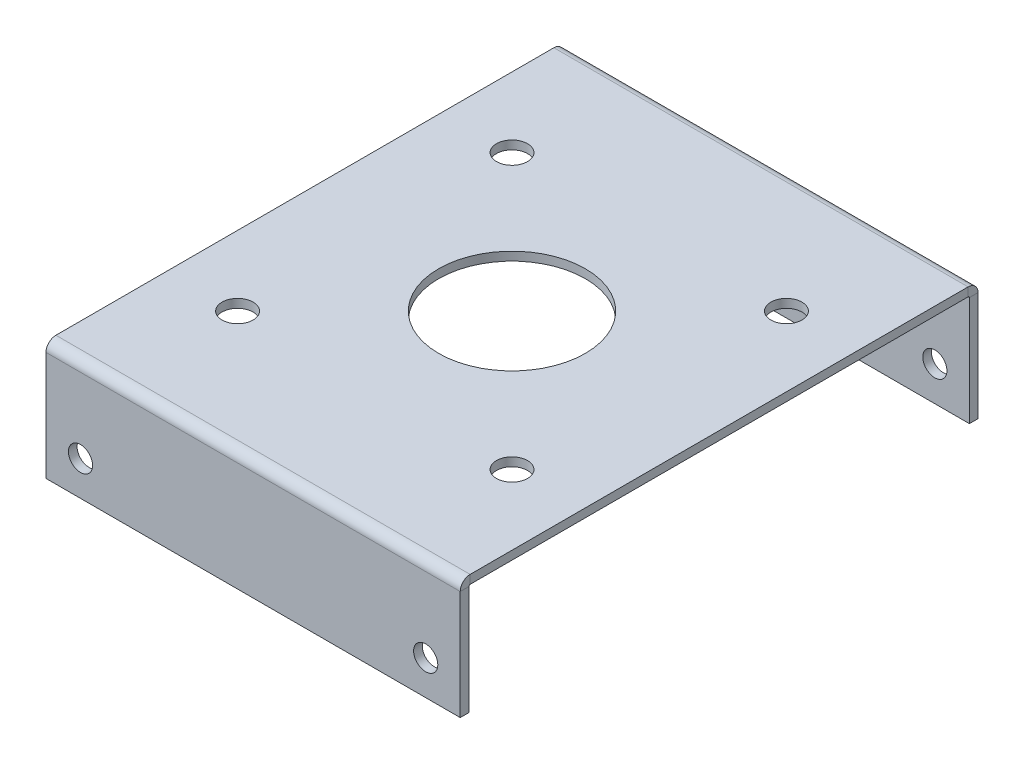
ISO-10303-21;
HEADER;
FILE_DESCRIPTION(('STEP AP214'),'2;1');
FILE_NAME('part.step','',(''),(''),'','','');
FILE_SCHEMA(('AUTOMOTIVE_DESIGN { 1 0 10303 214 1 1 1 1 }'));
ENDSEC;
DATA;
#1=APPLICATION_CONTEXT('core data for automotive mechanical design processes');
#2=APPLICATION_PROTOCOL_DEFINITION('international standard','automotive_design',2000,#1);
#3=PRODUCT_CONTEXT('',#1,'mechanical');
#4=PRODUCT('Part','Part','',(#3));
#5=PRODUCT_RELATED_PRODUCT_CATEGORY('part','',(#4));
#6=PRODUCT_DEFINITION_FORMATION('','',#4);
#7=PRODUCT_DEFINITION_CONTEXT('part definition',#1,'design');
#8=PRODUCT_DEFINITION('design','',#6,#7);
#9=PRODUCT_DEFINITION_SHAPE('','',#8);
#10=(LENGTH_UNIT() NAMED_UNIT(*) SI_UNIT(.MILLI.,.METRE.));
#11=(NAMED_UNIT(*) PLANE_ANGLE_UNIT() SI_UNIT($,.RADIAN.));
#12=(NAMED_UNIT(*) SI_UNIT($,.STERADIAN.) SOLID_ANGLE_UNIT());
#13=UNCERTAINTY_MEASURE_WITH_UNIT(LENGTH_MEASURE(1.E-05),#10,'distance_accuracy_value','');
#14=(GEOMETRIC_REPRESENTATION_CONTEXT(3) GLOBAL_UNCERTAINTY_ASSIGNED_CONTEXT((#13)) GLOBAL_UNIT_ASSIGNED_CONTEXT((#10,
#11,#12)) REPRESENTATION_CONTEXT('',''));
#15=CARTESIAN_POINT('',(0.,0.,0.));
#16=DIRECTION('',(0.,0.,1.));
#17=DIRECTION('',(1.,0.,0.));
#18=AXIS2_PLACEMENT_3D('',#15,#16,#17);
#19=CARTESIAN_POINT('',(0.,-5.,0.));
#20=DIRECTION('',(0.,-1.,0.));
#21=DIRECTION('',(0.,0.,-1.));
#22=AXIS2_PLACEMENT_3D('',#19,#20,#21);
#23=PLANE('',#22);
#24=CARTESIAN_POINT('',(79.5,-5.,79.5));
#25=DIRECTION('',(0.,-1.,0.));
#26=DIRECTION('',(0.,0.,-1.));
#27=AXIS2_PLACEMENT_3D('',#24,#25,#26);
#28=CIRCLE('',#27,8.99999999999999);
#29=CARTESIAN_POINT('',(79.5,-5.,70.5));
#30=VERTEX_POINT('',#29);
#31=EDGE_CURVE('E304',#30,#30,#28,.T.);
#32=ORIENTED_EDGE('',*,*,#31,.F.);
#33=EDGE_LOOP('',(#32));
#34=FACE_BOUND('',#33,.T.);
#35=CARTESIAN_POINT('',(-79.5,-5.,79.5));
#36=DIRECTION('',(0.,-1.,0.));
#37=DIRECTION('',(0.,0.,-1.));
#38=AXIS2_PLACEMENT_3D('',#35,#36,#37);
#39=CIRCLE('',#38,8.99999999999999);
#40=CARTESIAN_POINT('',(-79.5,-5.,70.5));
#41=VERTEX_POINT('',#40);
#42=EDGE_CURVE('E735',#41,#41,#39,.T.);
#43=ORIENTED_EDGE('',*,*,#42,.F.);
#44=EDGE_LOOP('',(#43));
#45=FACE_BOUND('',#44,.T.);
#46=CARTESIAN_POINT('',(-79.5,-5.,-79.5));
#47=DIRECTION('',(0.,-1.,0.));
#48=DIRECTION('',(0.,0.,-1.));
#49=AXIS2_PLACEMENT_3D('',#46,#47,#48);
#50=CIRCLE('',#49,8.99999999999999);
#51=CARTESIAN_POINT('',(-79.5,-5.,-88.5));
#52=VERTEX_POINT('',#51);
#53=EDGE_CURVE('E733',#52,#52,#50,.T.);
#54=ORIENTED_EDGE('',*,*,#53,.F.);
#55=EDGE_LOOP('',(#54));
#56=FACE_BOUND('',#55,.T.);
#57=CARTESIAN_POINT('',(79.5,-5.,-79.5));
#58=DIRECTION('',(0.,-1.,0.));
#59=DIRECTION('',(0.,0.,-1.));
#60=AXIS2_PLACEMENT_3D('',#57,#58,#59);
#61=CIRCLE('',#60,8.99999999999999);
#62=CARTESIAN_POINT('',(79.5,-5.,-88.5));
#63=VERTEX_POINT('',#62);
#64=EDGE_CURVE('E730',#63,#63,#61,.T.);
#65=ORIENTED_EDGE('',*,*,#64,.F.);
#66=EDGE_LOOP('',(#65));
#67=FACE_BOUND('',#66,.T.);
#68=CARTESIAN_POINT('',(0.,-5.,0.));
#69=DIRECTION('',(0.,-1.,0.));
#70=DIRECTION('',(0.,0.,-1.));
#71=AXIS2_PLACEMENT_3D('',#68,#69,#70);
#72=CIRCLE('',#71,42.5);
#73=CARTESIAN_POINT('',(0.,-5.,-42.5));
#74=VERTEX_POINT('',#73);
#75=EDGE_CURVE('E726',#74,#74,#72,.T.);
#76=ORIENTED_EDGE('',*,*,#75,.F.);
#77=EDGE_LOOP('',(#76));
#78=FACE_BOUND('',#77,.T.);
#79=DIRECTION('',(0.,0.,-1.));
#80=VECTOR('',#79,1.);
#81=CARTESIAN_POINT('',(120.,-5.,150.));
#82=LINE('',#81,#80);
#83=CARTESIAN_POINT('',(120.,-5.,144.2634));
#84=VERTEX_POINT('',#83);
#85=CARTESIAN_POINT('',(120.,-5.,-144.2634));
#86=VERTEX_POINT('',#85);
#87=EDGE_CURVE('E86',#84,#86,#82,.T.);
#88=ORIENTED_EDGE('',*,*,#87,.F.);
#89=DIRECTION('',(-1.,0.,0.));
#90=VECTOR('',#89,1.);
#91=CARTESIAN_POINT('',(-120.,-5.,144.2634));
#92=LINE('',#91,#90);
#93=CARTESIAN_POINT('',(-120.,-5.,144.2634));
#94=VERTEX_POINT('',#93);
#95=EDGE_CURVE('E223',#94,#84,#92,.F.);
#96=ORIENTED_EDGE('',*,*,#95,.F.);
#97=DIRECTION('',(0.,0.,1.));
#98=VECTOR('',#97,1.);
#99=CARTESIAN_POINT('',(-120.,-5.,150.));
#100=LINE('',#99,#98);
#101=CARTESIAN_POINT('',(-120.,-5.,-144.2634));
#102=VERTEX_POINT('',#101);
#103=EDGE_CURVE('E13',#102,#94,#100,.T.);
#104=ORIENTED_EDGE('',*,*,#103,.F.);
#105=DIRECTION('',(1.,0.,0.));
#106=VECTOR('',#105,1.);
#107=CARTESIAN_POINT('',(120.,-5.00000000000001,-144.2634));
#108=LINE('',#107,#106);
#109=EDGE_CURVE('E277',#86,#102,#108,.F.);
#110=ORIENTED_EDGE('',*,*,#109,.F.);
#111=EDGE_LOOP('',(#88,#96,#104,#110));
#112=FACE_BOUND('',#111,.T.);
#113=ADVANCED_FACE('F77',(#34,#45,#56,#67,#78,#112),#23,.T.);
#114=CARTESIAN_POINT('',(0.,0.,0.));
#115=DIRECTION('',(0.,-1.,0.));
#116=DIRECTION('',(0.,0.,-1.));
#117=AXIS2_PLACEMENT_3D('',#114,#115,#116);
#118=PLANE('',#117);
#119=CARTESIAN_POINT('',(79.5,0.,79.5));
#120=DIRECTION('',(0.,1.,0.));
#121=DIRECTION('',(0.,0.,1.));
#122=AXIS2_PLACEMENT_3D('',#119,#120,#121);
#123=CIRCLE('',#122,8.99999999999999);
#124=CARTESIAN_POINT('',(79.5,0.,88.5));
#125=VERTEX_POINT('',#124);
#126=EDGE_CURVE('E715',#125,#125,#123,.T.);
#127=ORIENTED_EDGE('',*,*,#126,.F.);
#128=EDGE_LOOP('',(#127));
#129=FACE_BOUND('',#128,.T.);
#130=CARTESIAN_POINT('',(-79.5,0.,79.5));
#131=DIRECTION('',(0.,1.,0.));
#132=DIRECTION('',(0.,0.,1.));
#133=AXIS2_PLACEMENT_3D('',#130,#131,#132);
#134=CIRCLE('',#133,8.99999999999999);
#135=CARTESIAN_POINT('',(-79.5,0.,88.5));
#136=VERTEX_POINT('',#135);
#137=EDGE_CURVE('E716',#136,#136,#134,.T.);
#138=ORIENTED_EDGE('',*,*,#137,.F.);
#139=EDGE_LOOP('',(#138));
#140=FACE_BOUND('',#139,.T.);
#141=CARTESIAN_POINT('',(-79.5,0.,-79.5));
#142=DIRECTION('',(0.,1.,0.));
#143=DIRECTION('',(0.,0.,1.));
#144=AXIS2_PLACEMENT_3D('',#141,#142,#143);
#145=CIRCLE('',#144,8.99999999999999);
#146=CARTESIAN_POINT('',(-79.5,0.,-70.5));
#147=VERTEX_POINT('',#146);
#148=EDGE_CURVE('E719',#147,#147,#145,.T.);
#149=ORIENTED_EDGE('',*,*,#148,.F.);
#150=EDGE_LOOP('',(#149));
#151=FACE_BOUND('',#150,.T.);
#152=CARTESIAN_POINT('',(79.5,0.,-79.5));
#153=DIRECTION('',(0.,1.,0.));
#154=DIRECTION('',(0.,0.,1.));
#155=AXIS2_PLACEMENT_3D('',#152,#153,#154);
#156=CIRCLE('',#155,8.99999999999999);
#157=CARTESIAN_POINT('',(79.5,0.,-70.5));
#158=VERTEX_POINT('',#157);
#159=EDGE_CURVE('E727',#158,#158,#156,.T.);
#160=ORIENTED_EDGE('',*,*,#159,.F.);
#161=EDGE_LOOP('',(#160));
#162=FACE_BOUND('',#161,.T.);
#163=CARTESIAN_POINT('',(0.,0.,0.));
#164=DIRECTION('',(0.,1.,0.));
#165=DIRECTION('',(0.,0.,1.));
#166=AXIS2_PLACEMENT_3D('',#163,#164,#165);
#167=CIRCLE('',#166,42.5);
#168=CARTESIAN_POINT('',(0.,0.,42.5));
#169=VERTEX_POINT('',#168);
#170=EDGE_CURVE('E723',#169,#169,#167,.T.);
#171=ORIENTED_EDGE('',*,*,#170,.F.);
#172=EDGE_LOOP('',(#171));
#173=FACE_BOUND('',#172,.T.);
#174=DIRECTION('',(-1.,0.,0.));
#175=VECTOR('',#174,1.);
#176=CARTESIAN_POINT('',(-120.,0.,144.2634));
#177=LINE('',#176,#175);
#178=CARTESIAN_POINT('',(-120.,0.,144.2634));
#179=VERTEX_POINT('',#178);
#180=CARTESIAN_POINT('',(120.,0.,144.2634));
#181=VERTEX_POINT('',#180);
#182=EDGE_CURVE('E211',#179,#181,#177,.F.);
#183=ORIENTED_EDGE('',*,*,#182,.T.);
#184=DIRECTION('',(0.,0.,-1.));
#185=VECTOR('',#184,1.);
#186=CARTESIAN_POINT('',(120.,0.,150.));
#187=LINE('',#186,#185);
#188=CARTESIAN_POINT('',(120.,0.,-144.2634));
#189=VERTEX_POINT('',#188);
#190=EDGE_CURVE('E283',#181,#189,#187,.T.);
#191=ORIENTED_EDGE('',*,*,#190,.T.);
#192=DIRECTION('',(1.,0.,0.));
#193=VECTOR('',#192,1.);
#194=CARTESIAN_POINT('',(120.,0.,-144.2634));
#195=LINE('',#194,#193);
#196=CARTESIAN_POINT('',(-120.,0.,-144.2634));
#197=VERTEX_POINT('',#196);
#198=EDGE_CURVE('E265',#189,#197,#195,.F.);
#199=ORIENTED_EDGE('',*,*,#198,.T.);
#200=DIRECTION('',(0.,0.,1.));
#201=VECTOR('',#200,1.);
#202=CARTESIAN_POINT('',(-120.,0.,150.));
#203=LINE('',#202,#201);
#204=EDGE_CURVE('E285',#197,#179,#203,.T.);
#205=ORIENTED_EDGE('',*,*,#204,.T.);
#206=EDGE_LOOP('',(#183,#191,#199,#205));
#207=FACE_BOUND('',#206,.T.);
#208=ADVANCED_FACE('F336',(#129,#140,#151,#162,#173,#207),#118,.F.);
#209=CARTESIAN_POINT('',(-120.,-5.,150.));
#210=DIRECTION('',(-1.,0.,0.));
#211=DIRECTION('',(0.,0.,1.));
#212=AXIS2_PLACEMENT_3D('',#209,#210,#211);
#213=PLANE('',#212);
#214=ORIENTED_EDGE('',*,*,#103,.T.);
#215=DIRECTION('',(0.,1.,0.));
#216=VECTOR('',#215,1.);
#217=CARTESIAN_POINT('',(-120.,-5.,144.2634));
#218=LINE('',#217,#216);
#219=EDGE_CURVE('E217',#94,#179,#218,.T.);
#220=ORIENTED_EDGE('',*,*,#219,.T.);
#221=ORIENTED_EDGE('',*,*,#204,.F.);
#222=DIRECTION('',(0.,1.,0.));
#223=VECTOR('',#222,1.);
#224=CARTESIAN_POINT('',(-120.,-5.00000000000001,-144.2634));
#225=LINE('',#224,#223);
#226=EDGE_CURVE('E93',#102,#197,#225,.T.);
#227=ORIENTED_EDGE('',*,*,#226,.F.);
#228=EDGE_LOOP('',(#214,#220,#221,#227));
#229=FACE_BOUND('',#228,.T.);
#230=ADVANCED_FACE('F330',(#229),#213,.T.);
#231=CARTESIAN_POINT('',(120.,-5.,150.));
#232=DIRECTION('',(1.,0.,0.));
#233=DIRECTION('',(0.,0.,-1.));
#234=AXIS2_PLACEMENT_3D('',#231,#232,#233);
#235=PLANE('',#234);
#236=DIRECTION('',(0.,1.,0.));
#237=VECTOR('',#236,1.);
#238=CARTESIAN_POINT('',(120.,-5.,144.2634));
#239=LINE('',#238,#237);
#240=EDGE_CURVE('E229',#84,#181,#239,.T.);
#241=ORIENTED_EDGE('',*,*,#240,.F.);
#242=ORIENTED_EDGE('',*,*,#87,.T.);
#243=DIRECTION('',(0.,1.,0.));
#244=VECTOR('',#243,1.);
#245=CARTESIAN_POINT('',(120.,-5.00000000000001,-144.2634));
#246=LINE('',#245,#244);
#247=EDGE_CURVE('E271',#86,#189,#246,.T.);
#248=ORIENTED_EDGE('',*,*,#247,.T.);
#249=ORIENTED_EDGE('',*,*,#190,.F.);
#250=EDGE_LOOP('',(#241,#242,#248,#249));
#251=FACE_BOUND('',#250,.T.);
#252=ADVANCED_FACE('F79',(#251),#235,.T.);
#253=CARTESIAN_POINT('',(-120.,-5.73660000000001,-144.2634));
#254=DIRECTION('',(-1.,0.,0.));
#255=DIRECTION('',(0.,0.,1.));
#256=AXIS2_PLACEMENT_3D('',#253,#254,#255);
#257=PLANE('',#256);
#258=DIRECTION('',(0.,0.,1.));
#259=VECTOR('',#258,1.);
#260=CARTESIAN_POINT('',(-120.,-5.73659999999997,-150.));
#261=LINE('',#260,#259);
#262=CARTESIAN_POINT('',(-120.,-5.73660000000001,-145.));
#263=VERTEX_POINT('',#262);
#264=CARTESIAN_POINT('',(-120.,-5.73659999999999,-150.));
#265=VERTEX_POINT('',#264);
#266=EDGE_CURVE('E232',#263,#265,#261,.F.);
#267=ORIENTED_EDGE('',*,*,#266,.F.);
#268=CARTESIAN_POINT('',(-120.,-5.73660000000001,-144.2634));
#269=DIRECTION('',(1.,0.,0.));
#270=DIRECTION('',(0.,0.,-1.));
#271=AXIS2_PLACEMENT_3D('',#268,#269,#270);
#272=CIRCLE('',#271,0.736600000000004);
#273=EDGE_CURVE('E274',#102,#263,#272,.F.);
#274=ORIENTED_EDGE('',*,*,#273,.F.);
#275=ORIENTED_EDGE('',*,*,#226,.T.);
#276=CARTESIAN_POINT('',(-120.,-5.73660000000001,-144.2634));
#277=DIRECTION('',(1.,0.,0.));
#278=DIRECTION('',(0.,0.,-1.));
#279=AXIS2_PLACEMENT_3D('',#276,#277,#278);
#280=CIRCLE('',#279,5.7366);
#281=EDGE_CURVE('E267',#197,#265,#280,.F.);
#282=ORIENTED_EDGE('',*,*,#281,.T.);
#283=EDGE_LOOP('',(#267,#274,#275,#282));
#284=FACE_BOUND('',#283,.T.);
#285=ADVANCED_FACE('F370',(#284),#257,.T.);
#286=CARTESIAN_POINT('',(120.,-5.73660000000001,-144.2634));
#287=DIRECTION('',(-1.,0.,0.));
#288=DIRECTION('',(0.,0.,1.));
#289=AXIS2_PLACEMENT_3D('',#286,#287,#288);
#290=PLANE('',#289);
#291=CARTESIAN_POINT('',(120.,-5.73660000000001,-144.2634));
#292=DIRECTION('',(1.,0.,0.));
#293=DIRECTION('',(0.,0.,-1.));
#294=AXIS2_PLACEMENT_3D('',#291,#292,#293);
#295=CIRCLE('',#294,0.736600000000004);
#296=CARTESIAN_POINT('',(120.,-5.73660000000001,-145.));
#297=VERTEX_POINT('',#296);
#298=EDGE_CURVE('E238',#297,#86,#295,.T.);
#299=ORIENTED_EDGE('',*,*,#298,.F.);
#300=DIRECTION('',(0.,0.,1.));
#301=VECTOR('',#300,1.);
#302=CARTESIAN_POINT('',(120.,-5.73660000000001,-145.));
#303=LINE('',#302,#301);
#304=CARTESIAN_POINT('',(120.,-5.73659999999997,-150.));
#305=VERTEX_POINT('',#304);
#306=EDGE_CURVE('E258',#297,#305,#303,.F.);
#307=ORIENTED_EDGE('',*,*,#306,.T.);
#308=CARTESIAN_POINT('',(120.,-5.73660000000001,-144.2634));
#309=DIRECTION('',(1.,0.,0.));
#310=DIRECTION('',(0.,0.,-1.));
#311=AXIS2_PLACEMENT_3D('',#308,#309,#310);
#312=CIRCLE('',#311,5.7366);
#313=EDGE_CURVE('E268',#305,#189,#312,.T.);
#314=ORIENTED_EDGE('',*,*,#313,.T.);
#315=ORIENTED_EDGE('',*,*,#247,.F.);
#316=EDGE_LOOP('',(#299,#307,#314,#315));
#317=FACE_BOUND('',#316,.T.);
#318=ADVANCED_FACE('F364',(#317),#290,.F.);
#319=CARTESIAN_POINT('',(120.,-5.73660000000001,-144.2634));
#320=DIRECTION('',(1.,0.,0.));
#321=DIRECTION('',(0.,0.,-1.));
#322=AXIS2_PLACEMENT_3D('',#319,#320,#321);
#323=CYLINDRICAL_SURFACE('',#322,5.7366);
#324=ORIENTED_EDGE('',*,*,#198,.F.);
#325=ORIENTED_EDGE('',*,*,#313,.F.);
#326=DIRECTION('',(1.,0.,0.));
#327=VECTOR('',#326,1.);
#328=CARTESIAN_POINT('',(-120.,-5.73659999999997,-150.));
#329=LINE('',#328,#327);
#330=EDGE_CURVE('E256',#305,#265,#329,.F.);
#331=ORIENTED_EDGE('',*,*,#330,.T.);
#332=ORIENTED_EDGE('',*,*,#281,.F.);
#333=EDGE_LOOP('',(#324,#325,#331,#332));
#334=FACE_BOUND('',#333,.T.);
#335=ADVANCED_FACE('F378',(#334),#323,.T.);
#336=CARTESIAN_POINT('',(120.,-5.73660000000001,-144.2634));
#337=DIRECTION('',(1.,0.,0.));
#338=DIRECTION('',(0.,0.,-1.));
#339=AXIS2_PLACEMENT_3D('',#336,#337,#338);
#340=CYLINDRICAL_SURFACE('',#339,0.736600000000004);
#341=ORIENTED_EDGE('',*,*,#109,.T.);
#342=ORIENTED_EDGE('',*,*,#273,.T.);
#343=DIRECTION('',(1.,0.,0.));
#344=VECTOR('',#343,1.);
#345=CARTESIAN_POINT('',(-120.,-5.73660000000001,-145.));
#346=LINE('',#345,#344);
#347=EDGE_CURVE('E261',#263,#297,#346,.T.);
#348=ORIENTED_EDGE('',*,*,#347,.T.);
#349=ORIENTED_EDGE('',*,*,#298,.T.);
#350=EDGE_LOOP('',(#341,#342,#348,#349));
#351=FACE_BOUND('',#350,.T.);
#352=ADVANCED_FACE('F381',(#351),#340,.F.);
#353=CARTESIAN_POINT('',(120.,-69.,-150.));
#354=DIRECTION('',(-1.,0.,0.));
#355=DIRECTION('',(0.,0.,1.));
#356=AXIS2_PLACEMENT_3D('',#353,#354,#355);
#357=PLANE('',#356);
#358=ORIENTED_EDGE('',*,*,#306,.F.);
#359=DIRECTION('',(0.,1.,0.));
#360=VECTOR('',#359,1.);
#361=CARTESIAN_POINT('',(120.,-69.,-145.));
#362=LINE('',#361,#360);
#363=CARTESIAN_POINT('',(120.,-69.,-145.));
#364=VERTEX_POINT('',#363);
#365=EDGE_CURVE('E254',#297,#364,#362,.F.);
#366=ORIENTED_EDGE('',*,*,#365,.T.);
#367=DIRECTION('',(0.,0.,1.));
#368=VECTOR('',#367,1.);
#369=CARTESIAN_POINT('',(120.,-69.,-150.));
#370=LINE('',#369,#368);
#371=CARTESIAN_POINT('',(120.,-69.,-150.));
#372=VERTEX_POINT('',#371);
#373=EDGE_CURVE('E235',#372,#364,#370,.T.);
#374=ORIENTED_EDGE('',*,*,#373,.F.);
#375=DIRECTION('',(0.,-1.,0.));
#376=VECTOR('',#375,1.);
#377=CARTESIAN_POINT('',(120.,5.37874449487257E-13,-150.));
#378=LINE('',#377,#376);
#379=EDGE_CURVE('E247',#305,#372,#378,.T.);
#380=ORIENTED_EDGE('',*,*,#379,.F.);
#381=EDGE_LOOP('',(#358,#366,#374,#380));
#382=FACE_BOUND('',#381,.T.);
#383=ADVANCED_FACE('F384',(#382),#357,.F.);
#384=CARTESIAN_POINT('',(-120.,-4.99999999999998,-150.));
#385=DIRECTION('',(1.,0.,0.));
#386=DIRECTION('',(0.,0.,-1.));
#387=AXIS2_PLACEMENT_3D('',#384,#385,#386);
#388=PLANE('',#387);
#389=ORIENTED_EDGE('',*,*,#266,.T.);
#390=DIRECTION('',(0.,1.,0.));
#391=VECTOR('',#390,1.);
#392=CARTESIAN_POINT('',(-120.,5.37874449487257E-13,-150.));
#393=LINE('',#392,#391);
#394=CARTESIAN_POINT('',(-120.,-69.,-150.));
#395=VERTEX_POINT('',#394);
#396=EDGE_CURVE('E242',#395,#265,#393,.T.);
#397=ORIENTED_EDGE('',*,*,#396,.F.);
#398=DIRECTION('',(0.,0.,1.));
#399=VECTOR('',#398,1.);
#400=CARTESIAN_POINT('',(-120.,-69.,-150.));
#401=LINE('',#400,#399);
#402=CARTESIAN_POINT('',(-120.,-69.,-145.));
#403=VERTEX_POINT('',#402);
#404=EDGE_CURVE('E239',#395,#403,#401,.T.);
#405=ORIENTED_EDGE('',*,*,#404,.T.);
#406=DIRECTION('',(0.,-1.,0.));
#407=VECTOR('',#406,1.);
#408=CARTESIAN_POINT('',(-120.,-5.,-145.));
#409=LINE('',#408,#407);
#410=EDGE_CURVE('E249',#403,#263,#409,.F.);
#411=ORIENTED_EDGE('',*,*,#410,.T.);
#412=EDGE_LOOP('',(#389,#397,#405,#411));
#413=FACE_BOUND('',#412,.T.);
#414=ADVANCED_FACE('F390',(#413),#388,.F.);
#415=CARTESIAN_POINT('',(0.,5.37874449487257E-13,-150.));
#416=DIRECTION('',(0.,0.,1.));
#417=DIRECTION('',(0.,-1.,0.));
#418=AXIS2_PLACEMENT_3D('',#415,#416,#417);
#419=PLANE('',#418);
#420=CARTESIAN_POINT('',(-100.,-49.,-150.));
#421=DIRECTION('',(0.,0.,1.));
#422=DIRECTION('',(0.,-1.,0.));
#423=AXIS2_PLACEMENT_3D('',#420,#421,#422);
#424=CIRCLE('',#423,7.);
#425=CARTESIAN_POINT('',(-100.,-56.,-150.));
#426=VERTEX_POINT('',#425);
#427=EDGE_CURVE('E210',#426,#426,#424,.T.);
#428=ORIENTED_EDGE('',*,*,#427,.T.);
#429=EDGE_LOOP('',(#428));
#430=FACE_BOUND('',#429,.T.);
#431=CARTESIAN_POINT('',(100.,-49.,-150.));
#432=DIRECTION('',(0.,0.,1.));
#433=DIRECTION('',(0.,-1.,0.));
#434=AXIS2_PLACEMENT_3D('',#431,#432,#433);
#435=CIRCLE('',#434,7.);
#436=CARTESIAN_POINT('',(100.,-56.,-150.));
#437=VERTEX_POINT('',#436);
#438=EDGE_CURVE('E296',#437,#437,#435,.T.);
#439=ORIENTED_EDGE('',*,*,#438,.T.);
#440=EDGE_LOOP('',(#439));
#441=FACE_BOUND('',#440,.T.);
#442=ORIENTED_EDGE('',*,*,#330,.F.);
#443=ORIENTED_EDGE('',*,*,#379,.T.);
#444=DIRECTION('',(-1.,0.,0.));
#445=VECTOR('',#444,1.);
#446=CARTESIAN_POINT('',(0.,-69.,-150.));
#447=LINE('',#446,#445);
#448=EDGE_CURVE('E245',#372,#395,#447,.T.);
#449=ORIENTED_EDGE('',*,*,#448,.T.);
#450=ORIENTED_EDGE('',*,*,#396,.T.);
#451=EDGE_LOOP('',(#442,#443,#449,#450));
#452=FACE_BOUND('',#451,.T.);
#453=ADVANCED_FACE('F395',(#430,#441,#452),#419,.F.);
#454=CARTESIAN_POINT('',(0.,5.20417042793042E-13,-145.));
#455=DIRECTION('',(0.,0.,1.));
#456=DIRECTION('',(0.,-1.,0.));
#457=AXIS2_PLACEMENT_3D('',#454,#455,#456);
#458=PLANE('',#457);
#459=CARTESIAN_POINT('',(-100.,-49.,-145.));
#460=DIRECTION('',(0.,0.,1.));
#461=DIRECTION('',(0.,-1.,0.));
#462=AXIS2_PLACEMENT_3D('',#459,#460,#461);
#463=CIRCLE('',#462,7.);
#464=CARTESIAN_POINT('',(-100.,-56.,-145.));
#465=VERTEX_POINT('',#464);
#466=EDGE_CURVE('E311',#465,#465,#463,.T.);
#467=ORIENTED_EDGE('',*,*,#466,.F.);
#468=EDGE_LOOP('',(#467));
#469=FACE_BOUND('',#468,.T.);
#470=CARTESIAN_POINT('',(100.,-49.,-145.));
#471=DIRECTION('',(0.,0.,1.));
#472=DIRECTION('',(0.,-1.,0.));
#473=AXIS2_PLACEMENT_3D('',#470,#471,#472);
#474=CIRCLE('',#473,7.);
#475=CARTESIAN_POINT('',(100.,-56.,-145.));
#476=VERTEX_POINT('',#475);
#477=EDGE_CURVE('E291',#476,#476,#474,.T.);
#478=ORIENTED_EDGE('',*,*,#477,.F.);
#479=EDGE_LOOP('',(#478));
#480=FACE_BOUND('',#479,.T.);
#481=ORIENTED_EDGE('',*,*,#365,.F.);
#482=ORIENTED_EDGE('',*,*,#347,.F.);
#483=ORIENTED_EDGE('',*,*,#410,.F.);
#484=DIRECTION('',(1.,0.,0.));
#485=VECTOR('',#484,1.);
#486=CARTESIAN_POINT('',(-120.,-69.,-145.));
#487=LINE('',#486,#485);
#488=EDGE_CURVE('E252',#364,#403,#487,.F.);
#489=ORIENTED_EDGE('',*,*,#488,.F.);
#490=EDGE_LOOP('',(#481,#482,#483,#489));
#491=FACE_BOUND('',#490,.T.);
#492=ADVANCED_FACE('F349',(#469,#480,#491),#458,.T.);
#493=CARTESIAN_POINT('',(-120.,-69.,-150.));
#494=DIRECTION('',(0.,1.,0.));
#495=DIRECTION('',(0.,0.,1.));
#496=AXIS2_PLACEMENT_3D('',#493,#494,#495);
#497=PLANE('',#496);
#498=ORIENTED_EDGE('',*,*,#488,.T.);
#499=ORIENTED_EDGE('',*,*,#404,.F.);
#500=ORIENTED_EDGE('',*,*,#448,.F.);
#501=ORIENTED_EDGE('',*,*,#373,.T.);
#502=EDGE_LOOP('',(#498,#499,#500,#501));
#503=FACE_BOUND('',#502,.T.);
#504=ADVANCED_FACE('F342',(#503),#497,.F.);
#505=CARTESIAN_POINT('',(120.,-5.73660000000001,144.2634));
#506=DIRECTION('',(1.,0.,0.));
#507=DIRECTION('',(0.,0.,-1.));
#508=AXIS2_PLACEMENT_3D('',#505,#506,#507);
#509=PLANE('',#508);
#510=DIRECTION('',(0.,0.,-1.));
#511=VECTOR('',#510,1.);
#512=CARTESIAN_POINT('',(120.,-5.73660000000001,150.));
#513=LINE('',#512,#511);
#514=CARTESIAN_POINT('',(120.,-5.73660000000001,145.));
#515=VERTEX_POINT('',#514);
#516=CARTESIAN_POINT('',(120.,-5.73659999999999,150.));
#517=VERTEX_POINT('',#516);
#518=EDGE_CURVE('E192',#515,#517,#513,.F.);
#519=ORIENTED_EDGE('',*,*,#518,.F.);
#520=CARTESIAN_POINT('',(120.,-5.73660000000001,144.2634));
#521=DIRECTION('',(-1.,0.,0.));
#522=DIRECTION('',(0.,0.,1.));
#523=AXIS2_PLACEMENT_3D('',#520,#521,#522);
#524=CIRCLE('',#523,0.736600000000004);
#525=EDGE_CURVE('E220',#84,#515,#524,.F.);
#526=ORIENTED_EDGE('',*,*,#525,.F.);
#527=ORIENTED_EDGE('',*,*,#240,.T.);
#528=CARTESIAN_POINT('',(120.,-5.73660000000001,144.2634));
#529=DIRECTION('',(-1.,0.,0.));
#530=DIRECTION('',(0.,0.,1.));
#531=AXIS2_PLACEMENT_3D('',#528,#529,#530);
#532=CIRCLE('',#531,5.7366);
#533=EDGE_CURVE('E213',#181,#517,#532,.F.);
#534=ORIENTED_EDGE('',*,*,#533,.T.);
#535=EDGE_LOOP('',(#519,#526,#527,#534));
#536=FACE_BOUND('',#535,.T.);
#537=ADVANCED_FACE('F340',(#536),#509,.T.);
#538=CARTESIAN_POINT('',(-120.,-5.73660000000001,144.2634));
#539=DIRECTION('',(1.,0.,0.));
#540=DIRECTION('',(0.,0.,-1.));
#541=AXIS2_PLACEMENT_3D('',#538,#539,#540);
#542=PLANE('',#541);
#543=CARTESIAN_POINT('',(-120.,-5.73660000000001,144.2634));
#544=DIRECTION('',(-1.,0.,0.));
#545=DIRECTION('',(0.,0.,1.));
#546=AXIS2_PLACEMENT_3D('',#543,#544,#545);
#547=CIRCLE('',#546,0.736600000000004);
#548=CARTESIAN_POINT('',(-120.,-5.73660000000001,145.));
#549=VERTEX_POINT('',#548);
#550=EDGE_CURVE('E226',#549,#94,#547,.T.);
#551=ORIENTED_EDGE('',*,*,#550,.F.);
#552=DIRECTION('',(0.,0.,-1.));
#553=VECTOR('',#552,1.);
#554=CARTESIAN_POINT('',(-120.,-5.73660000000001,145.));
#555=LINE('',#554,#553);
#556=CARTESIAN_POINT('',(-120.,-5.73660000000001,150.));
#557=VERTEX_POINT('',#556);
#558=EDGE_CURVE('E204',#549,#557,#555,.F.);
#559=ORIENTED_EDGE('',*,*,#558,.T.);
#560=CARTESIAN_POINT('',(-120.,-5.73660000000001,144.2634));
#561=DIRECTION('',(-1.,0.,0.));
#562=DIRECTION('',(0.,0.,1.));
#563=AXIS2_PLACEMENT_3D('',#560,#561,#562);
#564=CIRCLE('',#563,5.7366);
#565=EDGE_CURVE('E214',#557,#179,#564,.T.);
#566=ORIENTED_EDGE('',*,*,#565,.T.);
#567=ORIENTED_EDGE('',*,*,#219,.F.);
#568=EDGE_LOOP('',(#551,#559,#566,#567));
#569=FACE_BOUND('',#568,.T.);
#570=ADVANCED_FACE('F328',(#569),#542,.F.);
#571=CARTESIAN_POINT('',(-120.,-5.73660000000001,144.2634));
#572=DIRECTION('',(-1.,0.,0.));
#573=DIRECTION('',(0.,0.,1.));
#574=AXIS2_PLACEMENT_3D('',#571,#572,#573);
#575=CYLINDRICAL_SURFACE('',#574,5.7366);
#576=ORIENTED_EDGE('',*,*,#182,.F.);
#577=ORIENTED_EDGE('',*,*,#565,.F.);
#578=DIRECTION('',(-1.,0.,0.));
#579=VECTOR('',#578,1.);
#580=CARTESIAN_POINT('',(120.,-5.73660000000001,150.));
#581=LINE('',#580,#579);
#582=EDGE_CURVE('E202',#557,#517,#581,.F.);
#583=ORIENTED_EDGE('',*,*,#582,.T.);
#584=ORIENTED_EDGE('',*,*,#533,.F.);
#585=EDGE_LOOP('',(#576,#577,#583,#584));
#586=FACE_BOUND('',#585,.T.);
#587=ADVANCED_FACE('F333',(#586),#575,.T.);
#588=CARTESIAN_POINT('',(-120.,-5.73660000000001,144.2634));
#589=DIRECTION('',(-1.,0.,0.));
#590=DIRECTION('',(0.,0.,1.));
#591=AXIS2_PLACEMENT_3D('',#588,#589,#590);
#592=CYLINDRICAL_SURFACE('',#591,0.736600000000004);
#593=ORIENTED_EDGE('',*,*,#95,.T.);
#594=ORIENTED_EDGE('',*,*,#525,.T.);
#595=DIRECTION('',(-1.,0.,0.));
#596=VECTOR('',#595,1.);
#597=CARTESIAN_POINT('',(120.,-5.73660000000001,145.));
#598=LINE('',#597,#596);
#599=EDGE_CURVE('E207',#515,#549,#598,.T.);
#600=ORIENTED_EDGE('',*,*,#599,.T.);
#601=ORIENTED_EDGE('',*,*,#550,.T.);
#602=EDGE_LOOP('',(#593,#594,#600,#601));
#603=FACE_BOUND('',#602,.T.);
#604=ADVANCED_FACE('F324',(#603),#592,.F.);
#605=CARTESIAN_POINT('',(-120.,-69.,150.));
#606=DIRECTION('',(1.,0.,0.));
#607=DIRECTION('',(0.,0.,-1.));
#608=AXIS2_PLACEMENT_3D('',#605,#606,#607);
#609=PLANE('',#608);
#610=ORIENTED_EDGE('',*,*,#558,.F.);
#611=DIRECTION('',(0.,1.,0.));
#612=VECTOR('',#611,1.);
#613=CARTESIAN_POINT('',(-120.,-69.,145.));
#614=LINE('',#613,#612);
#615=CARTESIAN_POINT('',(-120.,-69.,145.));
#616=VERTEX_POINT('',#615);
#617=EDGE_CURVE('E200',#549,#616,#614,.F.);
#618=ORIENTED_EDGE('',*,*,#617,.T.);
#619=DIRECTION('',(0.,0.,-1.));
#620=VECTOR('',#619,1.);
#621=CARTESIAN_POINT('',(-120.,-69.,150.));
#622=LINE('',#621,#620);
#623=CARTESIAN_POINT('',(-120.,-69.,150.));
#624=VERTEX_POINT('',#623);
#625=EDGE_CURVE('E188',#624,#616,#622,.T.);
#626=ORIENTED_EDGE('',*,*,#625,.F.);
#627=DIRECTION('',(0.,-1.,0.));
#628=VECTOR('',#627,1.);
#629=CARTESIAN_POINT('',(-120.,5.37874449487257E-13,150.));
#630=LINE('',#629,#628);
#631=EDGE_CURVE('E175',#557,#624,#630,.T.);
#632=ORIENTED_EDGE('',*,*,#631,.F.);
#633=EDGE_LOOP('',(#610,#618,#626,#632));
#634=FACE_BOUND('',#633,.T.);
#635=ADVANCED_FACE('F317',(#634),#609,.F.);
#636=CARTESIAN_POINT('',(120.,-4.99999999999998,150.));
#637=DIRECTION('',(-1.,0.,0.));
#638=DIRECTION('',(0.,0.,1.));
#639=AXIS2_PLACEMENT_3D('',#636,#637,#638);
#640=PLANE('',#639);
#641=ORIENTED_EDGE('',*,*,#518,.T.);
#642=DIRECTION('',(0.,1.,0.));
#643=VECTOR('',#642,1.);
#644=CARTESIAN_POINT('',(120.,5.37874449487257E-13,150.));
#645=LINE('',#644,#643);
#646=CARTESIAN_POINT('',(120.,-69.,150.));
#647=VERTEX_POINT('',#646);
#648=EDGE_CURVE('E173',#647,#517,#645,.T.);
#649=ORIENTED_EDGE('',*,*,#648,.F.);
#650=DIRECTION('',(0.,0.,-1.));
#651=VECTOR('',#650,1.);
#652=CARTESIAN_POINT('',(120.,-69.,150.));
#653=LINE('',#652,#651);
#654=CARTESIAN_POINT('',(120.,-69.,145.));
#655=VERTEX_POINT('',#654);
#656=EDGE_CURVE('E181',#647,#655,#653,.T.);
#657=ORIENTED_EDGE('',*,*,#656,.T.);
#658=DIRECTION('',(0.,-1.,0.));
#659=VECTOR('',#658,1.);
#660=CARTESIAN_POINT('',(120.,-5.,145.));
#661=LINE('',#660,#659);
#662=EDGE_CURVE('E197',#655,#515,#661,.F.);
#663=ORIENTED_EDGE('',*,*,#662,.T.);
#664=EDGE_LOOP('',(#641,#649,#657,#663));
#665=FACE_BOUND('',#664,.T.);
#666=ADVANCED_FACE('F191',(#665),#640,.F.);
#667=CARTESIAN_POINT('',(0.,5.37874449487257E-13,150.));
#668=DIRECTION('',(0.,0.,-1.));
#669=DIRECTION('',(0.,1.,0.));
#670=AXIS2_PLACEMENT_3D('',#667,#668,#669);
#671=PLANE('',#670);
#672=CARTESIAN_POINT('',(-100.,-49.0000000000011,150.));
#673=DIRECTION('',(0.,0.,-1.));
#674=DIRECTION('',(0.,1.,0.));
#675=AXIS2_PLACEMENT_3D('',#672,#673,#674);
#676=CIRCLE('',#675,7.);
#677=CARTESIAN_POINT('',(-100.,-42.0000000000011,150.));
#678=VERTEX_POINT('',#677);
#679=EDGE_CURVE('E292',#678,#678,#676,.T.);
#680=ORIENTED_EDGE('',*,*,#679,.T.);
#681=EDGE_LOOP('',(#680));
#682=FACE_BOUND('',#681,.T.);
#683=CARTESIAN_POINT('',(100.,-49.0000000000011,150.));
#684=DIRECTION('',(0.,0.,-1.));
#685=DIRECTION('',(0.,1.,0.));
#686=AXIS2_PLACEMENT_3D('',#683,#684,#685);
#687=CIRCLE('',#686,7.);
#688=CARTESIAN_POINT('',(100.,-42.0000000000011,150.));
#689=VERTEX_POINT('',#688);
#690=EDGE_CURVE('E299',#689,#689,#687,.T.);
#691=ORIENTED_EDGE('',*,*,#690,.T.);
#692=EDGE_LOOP('',(#691));
#693=FACE_BOUND('',#692,.T.);
#694=ORIENTED_EDGE('',*,*,#582,.F.);
#695=ORIENTED_EDGE('',*,*,#631,.T.);
#696=DIRECTION('',(1.,0.,0.));
#697=VECTOR('',#696,1.);
#698=CARTESIAN_POINT('',(0.,-69.,150.));
#699=LINE('',#698,#697);
#700=EDGE_CURVE('E168',#624,#647,#699,.T.);
#701=ORIENTED_EDGE('',*,*,#700,.T.);
#702=ORIENTED_EDGE('',*,*,#648,.T.);
#703=EDGE_LOOP('',(#694,#695,#701,#702));
#704=FACE_BOUND('',#703,.T.);
#705=ADVANCED_FACE('F171',(#682,#693,#704),#671,.F.);
#706=CARTESIAN_POINT('',(0.,5.20417042793042E-13,145.));
#707=DIRECTION('',(0.,0.,-1.));
#708=DIRECTION('',(0.,1.,0.));
#709=AXIS2_PLACEMENT_3D('',#706,#707,#708);
#710=PLANE('',#709);
#711=CARTESIAN_POINT('',(-100.,-49.000000000001,145.));
#712=DIRECTION('',(0.,0.,-1.));
#713=DIRECTION('',(0.,1.,0.));
#714=AXIS2_PLACEMENT_3D('',#711,#712,#713);
#715=CIRCLE('',#714,7.);
#716=CARTESIAN_POINT('',(-100.,-42.000000000001,145.));
#717=VERTEX_POINT('',#716);
#718=EDGE_CURVE('E81',#717,#717,#715,.T.);
#719=ORIENTED_EDGE('',*,*,#718,.F.);
#720=EDGE_LOOP('',(#719));
#721=FACE_BOUND('',#720,.T.);
#722=CARTESIAN_POINT('',(100.,-49.000000000001,145.));
#723=DIRECTION('',(0.,0.,-1.));
#724=DIRECTION('',(0.,1.,0.));
#725=AXIS2_PLACEMENT_3D('',#722,#723,#724);
#726=CIRCLE('',#725,7.);
#727=CARTESIAN_POINT('',(100.,-42.000000000001,145.));
#728=VERTEX_POINT('',#727);
#729=EDGE_CURVE('E289',#728,#728,#726,.T.);
#730=ORIENTED_EDGE('',*,*,#729,.F.);
#731=EDGE_LOOP('',(#730));
#732=FACE_BOUND('',#731,.T.);
#733=ORIENTED_EDGE('',*,*,#617,.F.);
#734=ORIENTED_EDGE('',*,*,#599,.F.);
#735=ORIENTED_EDGE('',*,*,#662,.F.);
#736=DIRECTION('',(-1.,0.,0.));
#737=VECTOR('',#736,1.);
#738=CARTESIAN_POINT('',(120.,-69.,145.));
#739=LINE('',#738,#737);
#740=EDGE_CURVE('E184',#616,#655,#739,.F.);
#741=ORIENTED_EDGE('',*,*,#740,.F.);
#742=EDGE_LOOP('',(#733,#734,#735,#741));
#743=FACE_BOUND('',#742,.T.);
#744=ADVANCED_FACE('F321',(#721,#732,#743),#710,.T.);
#745=CARTESIAN_POINT('',(120.,-69.,150.));
#746=DIRECTION('',(0.,1.,0.));
#747=DIRECTION('',(0.,0.,1.));
#748=AXIS2_PLACEMENT_3D('',#745,#746,#747);
#749=PLANE('',#748);
#750=ORIENTED_EDGE('',*,*,#740,.T.);
#751=ORIENTED_EDGE('',*,*,#656,.F.);
#752=ORIENTED_EDGE('',*,*,#700,.F.);
#753=ORIENTED_EDGE('',*,*,#625,.T.);
#754=EDGE_LOOP('',(#750,#751,#752,#753));
#755=FACE_BOUND('',#754,.T.);
#756=ADVANCED_FACE('F182',(#755),#749,.F.);
#757=CARTESIAN_POINT('',(100.,-49.0000000000011,150.));
#758=DIRECTION('',(0.,0.,-1.));
#759=DIRECTION('',(0.,1.,0.));
#760=AXIS2_PLACEMENT_3D('',#757,#758,#759);
#761=CYLINDRICAL_SURFACE('',#760,7.);
#762=ORIENTED_EDGE('',*,*,#729,.T.);
#763=EDGE_LOOP('',(#762));
#764=FACE_BOUND('',#763,.T.);
#765=ORIENTED_EDGE('',*,*,#690,.F.);
#766=EDGE_LOOP('',(#765));
#767=FACE_BOUND('',#766,.T.);
#768=ADVANCED_FACE('F431',(#764,#767),#761,.F.);
#769=CARTESIAN_POINT('',(-100.,-49.0000000000011,150.));
#770=DIRECTION('',(0.,0.,-1.));
#771=DIRECTION('',(0.,1.,0.));
#772=AXIS2_PLACEMENT_3D('',#769,#770,#771);
#773=CYLINDRICAL_SURFACE('',#772,7.);
#774=ORIENTED_EDGE('',*,*,#718,.T.);
#775=EDGE_LOOP('',(#774));
#776=FACE_BOUND('',#775,.T.);
#777=ORIENTED_EDGE('',*,*,#679,.F.);
#778=EDGE_LOOP('',(#777));
#779=FACE_BOUND('',#778,.T.);
#780=ADVANCED_FACE('F428',(#776,#779),#773,.F.);
#781=ORIENTED_EDGE('',*,*,#477,.T.);
#782=EDGE_LOOP('',(#781));
#783=FACE_BOUND('',#782,.T.);
#784=ORIENTED_EDGE('',*,*,#438,.F.);
#785=EDGE_LOOP('',(#784));
#786=FACE_BOUND('',#785,.T.);
#787=ADVANCED_FACE('F425',(#783,#786),#761,.F.);
#788=ORIENTED_EDGE('',*,*,#466,.T.);
#789=EDGE_LOOP('',(#788));
#790=FACE_BOUND('',#789,.T.);
#791=ORIENTED_EDGE('',*,*,#427,.F.);
#792=EDGE_LOOP('',(#791));
#793=FACE_BOUND('',#792,.T.);
#794=ADVANCED_FACE('F427',(#790,#793),#773,.F.);
#795=CARTESIAN_POINT('',(0.,-10.,0.));
#796=DIRECTION('',(0.,1.,0.));
#797=DIRECTION('',(0.,0.,1.));
#798=AXIS2_PLACEMENT_3D('',#795,#796,#797);
#799=CYLINDRICAL_SURFACE('',#798,42.5);
#800=ORIENTED_EDGE('',*,*,#75,.T.);
#801=EDGE_LOOP('',(#800));
#802=FACE_BOUND('',#801,.T.);
#803=ORIENTED_EDGE('',*,*,#170,.T.);
#804=EDGE_LOOP('',(#803));
#805=FACE_BOUND('',#804,.T.);
#806=ADVANCED_FACE('F436',(#802,#805),#799,.F.);
#807=CARTESIAN_POINT('',(79.5,-10.,-79.5));
#808=DIRECTION('',(0.,1.,0.));
#809=DIRECTION('',(0.,0.,1.));
#810=AXIS2_PLACEMENT_3D('',#807,#808,#809);
#811=CYLINDRICAL_SURFACE('',#810,8.99999999999999);
#812=ORIENTED_EDGE('',*,*,#64,.T.);
#813=EDGE_LOOP('',(#812));
#814=FACE_BOUND('',#813,.T.);
#815=ORIENTED_EDGE('',*,*,#159,.T.);
#816=EDGE_LOOP('',(#815));
#817=FACE_BOUND('',#816,.T.);
#818=ADVANCED_FACE('F555',(#814,#817),#811,.F.);
#819=CARTESIAN_POINT('',(-79.5,-10.,-79.5));
#820=DIRECTION('',(0.,1.,0.));
#821=DIRECTION('',(0.,0.,1.));
#822=AXIS2_PLACEMENT_3D('',#819,#820,#821);
#823=CYLINDRICAL_SURFACE('',#822,8.99999999999999);
#824=ORIENTED_EDGE('',*,*,#53,.T.);
#825=EDGE_LOOP('',(#824));
#826=FACE_BOUND('',#825,.T.);
#827=ORIENTED_EDGE('',*,*,#148,.T.);
#828=EDGE_LOOP('',(#827));
#829=FACE_BOUND('',#828,.T.);
#830=ADVANCED_FACE('F566',(#826,#829),#823,.F.);
#831=CARTESIAN_POINT('',(-79.5,-10.,79.5));
#832=DIRECTION('',(0.,1.,0.));
#833=DIRECTION('',(0.,0.,1.));
#834=AXIS2_PLACEMENT_3D('',#831,#832,#833);
#835=CYLINDRICAL_SURFACE('',#834,8.99999999999999);
#836=ORIENTED_EDGE('',*,*,#42,.T.);
#837=EDGE_LOOP('',(#836));
#838=FACE_BOUND('',#837,.T.);
#839=ORIENTED_EDGE('',*,*,#137,.T.);
#840=EDGE_LOOP('',(#839));
#841=FACE_BOUND('',#840,.T.);
#842=ADVANCED_FACE('F577',(#838,#841),#835,.F.);
#843=CARTESIAN_POINT('',(79.5,-10.,79.5));
#844=DIRECTION('',(0.,1.,0.));
#845=DIRECTION('',(0.,0.,1.));
#846=AXIS2_PLACEMENT_3D('',#843,#844,#845);
#847=CYLINDRICAL_SURFACE('',#846,8.99999999999999);
#848=ORIENTED_EDGE('',*,*,#31,.T.);
#849=EDGE_LOOP('',(#848));
#850=FACE_BOUND('',#849,.T.);
#851=ORIENTED_EDGE('',*,*,#126,.T.);
#852=EDGE_LOOP('',(#851));
#853=FACE_BOUND('',#852,.T.);
#854=ADVANCED_FACE('F588',(#850,#853),#847,.F.);
#855=CLOSED_SHELL('',(#113,#208,#230,#252,#285,#318,#335,#352,#383,#414,#453,#492,#504,#537,
#570,#587,#604,#635,#666,#705,#744,#756,#768,#780,#787,#794,#806,#818,#830,#842,#854));
#856=MANIFOLD_SOLID_BREP('B2',#855);
#857=ADVANCED_BREP_SHAPE_REPRESENTATION('',(#18,#856),#14);
#858=SHAPE_DEFINITION_REPRESENTATION(#9,#857);
ENDSEC;
END-ISO-10303-21;
